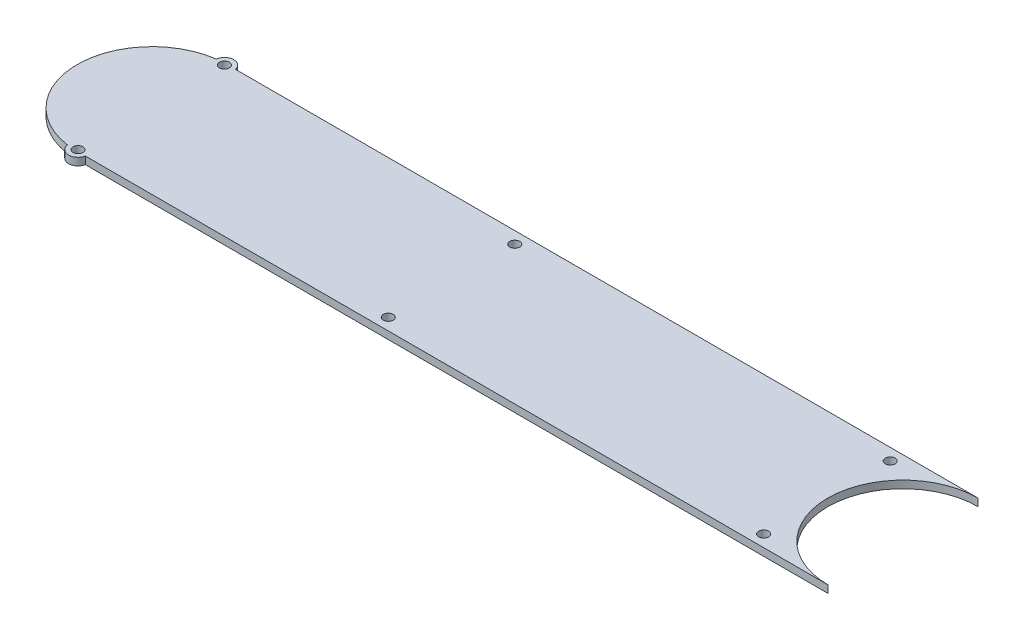
ISO-10303-21;
HEADER;
FILE_DESCRIPTION(('STEP AP214'),'2;1');
FILE_NAME('part.step','',(''),(''),'','','');
FILE_SCHEMA(('AUTOMOTIVE_DESIGN { 1 0 10303 214 1 1 1 1 }'));
ENDSEC;
DATA;
#1=APPLICATION_CONTEXT('core data for automotive mechanical design processes');
#2=APPLICATION_PROTOCOL_DEFINITION('international standard','automotive_design',2000,#1);
#3=PRODUCT_CONTEXT('',#1,'mechanical');
#4=PRODUCT('Part','Part','',(#3));
#5=PRODUCT_RELATED_PRODUCT_CATEGORY('part','',(#4));
#6=PRODUCT_DEFINITION_FORMATION('','',#4);
#7=PRODUCT_DEFINITION_CONTEXT('part definition',#1,'design');
#8=PRODUCT_DEFINITION('design','',#6,#7);
#9=PRODUCT_DEFINITION_SHAPE('','',#8);
#10=(LENGTH_UNIT() NAMED_UNIT(*) SI_UNIT(.MILLI.,.METRE.));
#11=(NAMED_UNIT(*) PLANE_ANGLE_UNIT() SI_UNIT($,.RADIAN.));
#12=(NAMED_UNIT(*) SI_UNIT($,.STERADIAN.) SOLID_ANGLE_UNIT());
#13=UNCERTAINTY_MEASURE_WITH_UNIT(LENGTH_MEASURE(1.E-05),#10,'distance_accuracy_value','');
#14=(GEOMETRIC_REPRESENTATION_CONTEXT(3) GLOBAL_UNCERTAINTY_ASSIGNED_CONTEXT((#13)) GLOBAL_UNIT_ASSIGNED_CONTEXT((#10,
#11,#12)) REPRESENTATION_CONTEXT('',''));
#15=CARTESIAN_POINT('',(0.,0.,0.));
#16=DIRECTION('',(0.,0.,1.));
#17=DIRECTION('',(1.,0.,0.));
#18=AXIS2_PLACEMENT_3D('',#15,#16,#17);
#19=CARTESIAN_POINT('',(-110.,2.,0.));
#20=DIRECTION('',(0.,-1.,0.));
#21=DIRECTION('',(0.,0.,-1.));
#22=AXIS2_PLACEMENT_3D('',#19,#20,#21);
#23=CYLINDRICAL_SURFACE('',#22,20.);
#24=CARTESIAN_POINT('',(-110.,2.,0.));
#25=DIRECTION('',(0.,1.,0.));
#26=DIRECTION('',(0.,0.,1.));
#27=AXIS2_PLACEMENT_3D('',#24,#25,#26);
#28=CIRCLE('',#27,20.);
#29=CARTESIAN_POINT('',(-112.730360118159,2.,-19.8127517933569));
#30=VERTEX_POINT('',#29);
#31=CARTESIAN_POINT('',(-112.730360118159,2.,19.8127517933569));
#32=VERTEX_POINT('',#31);
#33=EDGE_CURVE('E96',#30,#32,#28,.T.);
#34=ORIENTED_EDGE('',*,*,#33,.F.);
#35=DIRECTION('',(0.,1.,0.));
#36=VECTOR('',#35,1.);
#37=CARTESIAN_POINT('',(-112.730360118159,1.,-19.8127517933569));
#38=LINE('',#37,#36);
#39=CARTESIAN_POINT('',(-112.730360118159,0.,-19.8127517933569));
#40=VERTEX_POINT('',#39);
#41=EDGE_CURVE('E144',#30,#40,#38,.F.);
#42=ORIENTED_EDGE('',*,*,#41,.T.);
#43=CARTESIAN_POINT('',(-110.,0.,0.));
#44=DIRECTION('',(0.,1.,0.));
#45=DIRECTION('',(0.,0.,1.));
#46=AXIS2_PLACEMENT_3D('',#43,#44,#45);
#47=CIRCLE('',#46,20.);
#48=CARTESIAN_POINT('',(-112.730360118159,0.,19.8127517933569));
#49=VERTEX_POINT('',#48);
#50=EDGE_CURVE('E113',#40,#49,#47,.T.);
#51=ORIENTED_EDGE('',*,*,#50,.T.);
#52=DIRECTION('',(0.,1.,0.));
#53=VECTOR('',#52,1.);
#54=CARTESIAN_POINT('',(-112.730360118159,1.,19.8127517933569));
#55=LINE('',#54,#53);
#56=EDGE_CURVE('E137',#49,#32,#55,.T.);
#57=ORIENTED_EDGE('',*,*,#56,.T.);
#58=EDGE_LOOP('',(#34,#42,#51,#57));
#59=FACE_BOUND('',#58,.T.);
#60=ADVANCED_FACE('F37',(#59),#23,.T.);
#61=CARTESIAN_POINT('',(-110.,2.,20.));
#62=DIRECTION('',(0.,0.,-1.));
#63=DIRECTION('',(-1.,0.,0.));
#64=AXIS2_PLACEMENT_3D('',#61,#62,#63);
#65=PLANE('',#64);
#66=DIRECTION('',(1.,0.,0.));
#67=VECTOR('',#66,1.);
#68=CARTESIAN_POINT('',(-110.,2.,20.));
#69=LINE('',#68,#67);
#70=CARTESIAN_POINT('',(-107.800510257217,2.,20.));
#71=VERTEX_POINT('',#70);
#72=CARTESIAN_POINT('',(90.,2.,20.));
#73=VERTEX_POINT('',#72);
#74=EDGE_CURVE('E98',#71,#73,#69,.T.);
#75=ORIENTED_EDGE('',*,*,#74,.F.);
#76=DIRECTION('',(0.,1.,0.));
#77=VECTOR('',#76,1.);
#78=CARTESIAN_POINT('',(-107.800510257217,0.,20.));
#79=LINE('',#78,#77);
#80=CARTESIAN_POINT('',(-107.800510257217,0.,20.));
#81=VERTEX_POINT('',#80);
#82=EDGE_CURVE('E139',#71,#81,#79,.F.);
#83=ORIENTED_EDGE('',*,*,#82,.T.);
#84=DIRECTION('',(1.,0.,0.));
#85=VECTOR('',#84,1.);
#86=CARTESIAN_POINT('',(-110.,0.,20.));
#87=LINE('',#86,#85);
#88=CARTESIAN_POINT('',(90.,0.,20.));
#89=VERTEX_POINT('',#88);
#90=EDGE_CURVE('E81',#81,#89,#87,.T.);
#91=ORIENTED_EDGE('',*,*,#90,.T.);
#92=DIRECTION('',(0.,-1.,0.));
#93=VECTOR('',#92,1.);
#94=CARTESIAN_POINT('',(90.,2.,20.));
#95=LINE('',#94,#93);
#96=EDGE_CURVE('E11',#73,#89,#95,.T.);
#97=ORIENTED_EDGE('',*,*,#96,.F.);
#98=EDGE_LOOP('',(#75,#83,#91,#97));
#99=FACE_BOUND('',#98,.T.);
#100=ADVANCED_FACE('F206',(#99),#65,.F.);
#101=CARTESIAN_POINT('',(90.,2.,0.));
#102=DIRECTION('',(0.,-1.,0.));
#103=DIRECTION('',(0.,0.,-1.));
#104=AXIS2_PLACEMENT_3D('',#101,#102,#103);
#105=CYLINDRICAL_SURFACE('',#104,20.);
#106=CARTESIAN_POINT('',(90.,0.,0.));
#107=DIRECTION('',(0.,-1.,0.));
#108=DIRECTION('',(0.,0.,1.));
#109=AXIS2_PLACEMENT_3D('',#106,#107,#108);
#110=CIRCLE('',#109,20.);
#111=CARTESIAN_POINT('',(90.,0.,-20.));
#112=VERTEX_POINT('',#111);
#113=EDGE_CURVE('E72',#89,#112,#110,.T.);
#114=ORIENTED_EDGE('',*,*,#113,.T.);
#115=DIRECTION('',(0.,-1.,0.));
#116=VECTOR('',#115,1.);
#117=CARTESIAN_POINT('',(90.,2.,-20.));
#118=LINE('',#117,#116);
#119=CARTESIAN_POINT('',(90.,2.,-20.));
#120=VERTEX_POINT('',#119);
#121=EDGE_CURVE('E45',#120,#112,#118,.T.);
#122=ORIENTED_EDGE('',*,*,#121,.F.);
#123=CARTESIAN_POINT('',(90.,2.,0.));
#124=DIRECTION('',(0.,-1.,0.));
#125=DIRECTION('',(0.,0.,1.));
#126=AXIS2_PLACEMENT_3D('',#123,#124,#125);
#127=CIRCLE('',#126,20.);
#128=EDGE_CURVE('E60',#73,#120,#127,.T.);
#129=ORIENTED_EDGE('',*,*,#128,.F.);
#130=ORIENTED_EDGE('',*,*,#96,.T.);
#131=EDGE_LOOP('',(#114,#122,#129,#130));
#132=FACE_BOUND('',#131,.T.);
#133=ADVANCED_FACE('F74',(#132),#105,.F.);
#134=CARTESIAN_POINT('',(-110.,2.,-20.));
#135=DIRECTION('',(0.,0.,1.));
#136=DIRECTION('',(1.,0.,0.));
#137=AXIS2_PLACEMENT_3D('',#134,#135,#136);
#138=PLANE('',#137);
#139=DIRECTION('',(-1.,0.,0.));
#140=VECTOR('',#139,1.);
#141=CARTESIAN_POINT('',(-110.,0.,-20.));
#142=LINE('',#141,#140);
#143=CARTESIAN_POINT('',(-107.800510257217,0.,-20.));
#144=VERTEX_POINT('',#143);
#145=EDGE_CURVE('E80',#112,#144,#142,.T.);
#146=ORIENTED_EDGE('',*,*,#145,.T.);
#147=DIRECTION('',(0.,1.,0.));
#148=VECTOR('',#147,1.);
#149=CARTESIAN_POINT('',(-107.800510257217,0.,-20.));
#150=LINE('',#149,#148);
#151=CARTESIAN_POINT('',(-107.800510257217,2.,-20.));
#152=VERTEX_POINT('',#151);
#153=EDGE_CURVE('E148',#144,#152,#150,.T.);
#154=ORIENTED_EDGE('',*,*,#153,.T.);
#155=DIRECTION('',(-1.,0.,0.));
#156=VECTOR('',#155,1.);
#157=CARTESIAN_POINT('',(-110.,2.,-20.));
#158=LINE('',#157,#156);
#159=EDGE_CURVE('E88',#120,#152,#158,.T.);
#160=ORIENTED_EDGE('',*,*,#159,.F.);
#161=ORIENTED_EDGE('',*,*,#121,.T.);
#162=EDGE_LOOP('',(#146,#154,#160,#161));
#163=FACE_BOUND('',#162,.T.);
#164=ADVANCED_FACE('F85',(#163),#138,.F.);
#165=CARTESIAN_POINT('',(-110.,2.,0.));
#166=DIRECTION('',(0.,1.,0.));
#167=DIRECTION('',(0.,0.,1.));
#168=AXIS2_PLACEMENT_3D('',#165,#166,#167);
#169=PLANE('',#168);
#170=CARTESIAN_POINT('',(-110.25,2.,-19.5));
#171=DIRECTION('',(0.,1.,0.));
#172=DIRECTION('',(0.,0.,1.));
#173=AXIS2_PLACEMENT_3D('',#170,#171,#172);
#174=CIRCLE('',#173,1.32500000000001);
#175=CARTESIAN_POINT('',(-110.25,2.,-18.175));
#176=VERTEX_POINT('',#175);
#177=EDGE_CURVE('E161',#176,#176,#174,.T.);
#178=ORIENTED_EDGE('',*,*,#177,.F.);
#179=EDGE_LOOP('',(#178));
#180=FACE_BOUND('',#179,.T.);
#181=CARTESIAN_POINT('',(-110.25,2.,19.5));
#182=DIRECTION('',(0.,1.,0.));
#183=DIRECTION('',(0.,0.,1.));
#184=AXIS2_PLACEMENT_3D('',#181,#182,#183);
#185=CIRCLE('',#184,1.32500000000001);
#186=CARTESIAN_POINT('',(-110.25,2.,20.825));
#187=VERTEX_POINT('',#186);
#188=EDGE_CURVE('E155',#187,#187,#185,.T.);
#189=ORIENTED_EDGE('',*,*,#188,.F.);
#190=EDGE_LOOP('',(#189));
#191=FACE_BOUND('',#190,.T.);
#192=CARTESIAN_POINT('',(-110.25,2.,-19.5));
#193=DIRECTION('',(0.,1.,0.));
#194=DIRECTION('',(0.,0.,1.));
#195=AXIS2_PLACEMENT_3D('',#192,#193,#194);
#196=CIRCLE('',#195,2.5);
#197=EDGE_CURVE('E150',#152,#30,#196,.T.);
#198=ORIENTED_EDGE('',*,*,#197,.T.);
#199=ORIENTED_EDGE('',*,*,#33,.T.);
#200=CARTESIAN_POINT('',(-110.25,2.,19.5));
#201=DIRECTION('',(0.,1.,0.));
#202=DIRECTION('',(0.,0.,1.));
#203=AXIS2_PLACEMENT_3D('',#200,#201,#202);
#204=CIRCLE('',#203,2.50000000000001);
#205=EDGE_CURVE('E53',#32,#71,#204,.T.);
#206=ORIENTED_EDGE('',*,*,#205,.T.);
#207=ORIENTED_EDGE('',*,*,#74,.T.);
#208=ORIENTED_EDGE('',*,*,#128,.T.);
#209=ORIENTED_EDGE('',*,*,#159,.T.);
#210=EDGE_LOOP('',(#198,#199,#206,#207,#208,#209));
#211=FACE_BOUND('',#210,.T.);
#212=CARTESIAN_POINT('',(69.75,2.,-16.85));
#213=DIRECTION('',(0.,1.,0.));
#214=DIRECTION('',(0.,0.,1.));
#215=AXIS2_PLACEMENT_3D('',#212,#213,#214);
#216=CIRCLE('',#215,1.32500000000001);
#217=CARTESIAN_POINT('',(69.75,2.,-15.525));
#218=VERTEX_POINT('',#217);
#219=EDGE_CURVE('E128',#218,#218,#216,.T.);
#220=ORIENTED_EDGE('',*,*,#219,.F.);
#221=EDGE_LOOP('',(#220));
#222=FACE_BOUND('',#221,.T.);
#223=CARTESIAN_POINT('',(-30.25,2.,16.85));
#224=DIRECTION('',(0.,1.,0.));
#225=DIRECTION('',(0.,0.,1.));
#226=AXIS2_PLACEMENT_3D('',#223,#224,#225);
#227=CIRCLE('',#226,1.32500000000001);
#228=CARTESIAN_POINT('',(-30.25,2.,18.175));
#229=VERTEX_POINT('',#228);
#230=EDGE_CURVE('E129',#229,#229,#227,.T.);
#231=ORIENTED_EDGE('',*,*,#230,.F.);
#232=EDGE_LOOP('',(#231));
#233=FACE_BOUND('',#232,.T.);
#234=CARTESIAN_POINT('',(-30.25,2.,-16.85));
#235=DIRECTION('',(0.,1.,0.));
#236=DIRECTION('',(0.,0.,1.));
#237=AXIS2_PLACEMENT_3D('',#234,#235,#236);
#238=CIRCLE('',#237,1.32500000000001);
#239=CARTESIAN_POINT('',(-30.25,2.,-15.525));
#240=VERTEX_POINT('',#239);
#241=EDGE_CURVE('E132',#240,#240,#238,.T.);
#242=ORIENTED_EDGE('',*,*,#241,.F.);
#243=EDGE_LOOP('',(#242));
#244=FACE_BOUND('',#243,.T.);
#245=CARTESIAN_POINT('',(69.75,2.,16.85));
#246=DIRECTION('',(0.,1.,0.));
#247=DIRECTION('',(0.,0.,1.));
#248=AXIS2_PLACEMENT_3D('',#245,#246,#247);
#249=CIRCLE('',#248,1.32500000000001);
#250=CARTESIAN_POINT('',(69.75,2.,18.175));
#251=VERTEX_POINT('',#250);
#252=EDGE_CURVE('E106',#251,#251,#249,.T.);
#253=ORIENTED_EDGE('',*,*,#252,.F.);
#254=EDGE_LOOP('',(#253));
#255=FACE_BOUND('',#254,.T.);
#256=ADVANCED_FACE('F176',(#180,#191,#211,#222,#233,#244,#255),#169,.T.);
#257=CARTESIAN_POINT('',(-110.,0.,0.));
#258=DIRECTION('',(0.,1.,0.));
#259=DIRECTION('',(0.,0.,1.));
#260=AXIS2_PLACEMENT_3D('',#257,#258,#259);
#261=PLANE('',#260);
#262=CARTESIAN_POINT('',(-110.25,0.,-19.5));
#263=DIRECTION('',(0.,1.,0.));
#264=DIRECTION('',(0.,0.,1.));
#265=AXIS2_PLACEMENT_3D('',#262,#263,#264);
#266=CIRCLE('',#265,1.32500000000001);
#267=CARTESIAN_POINT('',(-110.25,0.,-18.175));
#268=VERTEX_POINT('',#267);
#269=EDGE_CURVE('E153',#268,#268,#266,.T.);
#270=ORIENTED_EDGE('',*,*,#269,.T.);
#271=EDGE_LOOP('',(#270));
#272=FACE_BOUND('',#271,.T.);
#273=CARTESIAN_POINT('',(-110.25,0.,19.5));
#274=DIRECTION('',(0.,1.,0.));
#275=DIRECTION('',(0.,0.,1.));
#276=AXIS2_PLACEMENT_3D('',#273,#274,#275);
#277=CIRCLE('',#276,1.32500000000001);
#278=CARTESIAN_POINT('',(-110.25,0.,20.825));
#279=VERTEX_POINT('',#278);
#280=EDGE_CURVE('E158',#279,#279,#277,.T.);
#281=ORIENTED_EDGE('',*,*,#280,.T.);
#282=EDGE_LOOP('',(#281));
#283=FACE_BOUND('',#282,.T.);
#284=ORIENTED_EDGE('',*,*,#50,.F.);
#285=CARTESIAN_POINT('',(-110.25,0.,-19.5));
#286=DIRECTION('',(0.,1.,0.));
#287=DIRECTION('',(0.,0.,1.));
#288=AXIS2_PLACEMENT_3D('',#285,#286,#287);
#289=CIRCLE('',#288,2.5);
#290=EDGE_CURVE('E95',#144,#40,#289,.T.);
#291=ORIENTED_EDGE('',*,*,#290,.F.);
#292=ORIENTED_EDGE('',*,*,#145,.F.);
#293=ORIENTED_EDGE('',*,*,#113,.F.);
#294=ORIENTED_EDGE('',*,*,#90,.F.);
#295=CARTESIAN_POINT('',(-110.25,0.,19.5));
#296=DIRECTION('',(0.,1.,0.));
#297=DIRECTION('',(0.,0.,1.));
#298=AXIS2_PLACEMENT_3D('',#295,#296,#297);
#299=CIRCLE('',#298,2.50000000000001);
#300=EDGE_CURVE('E142',#49,#81,#299,.T.);
#301=ORIENTED_EDGE('',*,*,#300,.F.);
#302=EDGE_LOOP('',(#284,#291,#292,#293,#294,#301));
#303=FACE_BOUND('',#302,.T.);
#304=CARTESIAN_POINT('',(69.75,0.,-16.85));
#305=DIRECTION('',(0.,1.,0.));
#306=DIRECTION('',(0.,0.,1.));
#307=AXIS2_PLACEMENT_3D('',#304,#305,#306);
#308=CIRCLE('',#307,1.32500000000001);
#309=CARTESIAN_POINT('',(69.75,0.,-15.525));
#310=VERTEX_POINT('',#309);
#311=EDGE_CURVE('E40',#310,#310,#308,.T.);
#312=ORIENTED_EDGE('',*,*,#311,.T.);
#313=EDGE_LOOP('',(#312));
#314=FACE_BOUND('',#313,.T.);
#315=CARTESIAN_POINT('',(-30.25,0.,16.85));
#316=DIRECTION('',(0.,1.,0.));
#317=DIRECTION('',(0.,0.,1.));
#318=AXIS2_PLACEMENT_3D('',#315,#316,#317);
#319=CIRCLE('',#318,1.32500000000001);
#320=CARTESIAN_POINT('',(-30.25,0.,18.175));
#321=VERTEX_POINT('',#320);
#322=EDGE_CURVE('E108',#321,#321,#319,.T.);
#323=ORIENTED_EDGE('',*,*,#322,.T.);
#324=EDGE_LOOP('',(#323));
#325=FACE_BOUND('',#324,.T.);
#326=CARTESIAN_POINT('',(-30.25,0.,-16.85));
#327=DIRECTION('',(0.,1.,0.));
#328=DIRECTION('',(0.,0.,1.));
#329=AXIS2_PLACEMENT_3D('',#326,#327,#328);
#330=CIRCLE('',#329,1.32500000000001);
#331=CARTESIAN_POINT('',(-30.25,0.,-15.525));
#332=VERTEX_POINT('',#331);
#333=EDGE_CURVE('E105',#332,#332,#330,.T.);
#334=ORIENTED_EDGE('',*,*,#333,.T.);
#335=EDGE_LOOP('',(#334));
#336=FACE_BOUND('',#335,.T.);
#337=CARTESIAN_POINT('',(69.75,0.,16.85));
#338=DIRECTION('',(0.,1.,0.));
#339=DIRECTION('',(0.,0.,1.));
#340=AXIS2_PLACEMENT_3D('',#337,#338,#339);
#341=CIRCLE('',#340,1.32500000000001);
#342=CARTESIAN_POINT('',(69.75,0.,18.175));
#343=VERTEX_POINT('',#342);
#344=EDGE_CURVE('E102',#343,#343,#341,.T.);
#345=ORIENTED_EDGE('',*,*,#344,.T.);
#346=EDGE_LOOP('',(#345));
#347=FACE_BOUND('',#346,.T.);
#348=ADVANCED_FACE('F92',(#272,#283,#303,#314,#325,#336,#347),#261,.F.);
#349=CARTESIAN_POINT('',(69.75,-1.,16.85));
#350=DIRECTION('',(0.,1.,0.));
#351=DIRECTION('',(0.,0.,1.));
#352=AXIS2_PLACEMENT_3D('',#349,#350,#351);
#353=CYLINDRICAL_SURFACE('',#352,1.32500000000001);
#354=ORIENTED_EDGE('',*,*,#252,.T.);
#355=EDGE_LOOP('',(#354));
#356=FACE_BOUND('',#355,.T.);
#357=ORIENTED_EDGE('',*,*,#344,.F.);
#358=EDGE_LOOP('',(#357));
#359=FACE_BOUND('',#358,.T.);
#360=ADVANCED_FACE('F193',(#356,#359),#353,.F.);
#361=CARTESIAN_POINT('',(-30.25,-1.,-16.85));
#362=DIRECTION('',(0.,1.,0.));
#363=DIRECTION('',(0.,0.,1.));
#364=AXIS2_PLACEMENT_3D('',#361,#362,#363);
#365=CYLINDRICAL_SURFACE('',#364,1.32500000000001);
#366=ORIENTED_EDGE('',*,*,#241,.T.);
#367=EDGE_LOOP('',(#366));
#368=FACE_BOUND('',#367,.T.);
#369=ORIENTED_EDGE('',*,*,#333,.F.);
#370=EDGE_LOOP('',(#369));
#371=FACE_BOUND('',#370,.T.);
#372=ADVANCED_FACE('F196',(#368,#371),#365,.F.);
#373=CARTESIAN_POINT('',(-30.25,-1.,16.85));
#374=DIRECTION('',(0.,1.,0.));
#375=DIRECTION('',(0.,0.,1.));
#376=AXIS2_PLACEMENT_3D('',#373,#374,#375);
#377=CYLINDRICAL_SURFACE('',#376,1.32500000000001);
#378=ORIENTED_EDGE('',*,*,#230,.T.);
#379=EDGE_LOOP('',(#378));
#380=FACE_BOUND('',#379,.T.);
#381=ORIENTED_EDGE('',*,*,#322,.F.);
#382=EDGE_LOOP('',(#381));
#383=FACE_BOUND('',#382,.T.);
#384=ADVANCED_FACE('F241',(#380,#383),#377,.F.);
#385=CARTESIAN_POINT('',(69.75,-1.,-16.85));
#386=DIRECTION('',(0.,1.,0.));
#387=DIRECTION('',(0.,0.,1.));
#388=AXIS2_PLACEMENT_3D('',#385,#386,#387);
#389=CYLINDRICAL_SURFACE('',#388,1.32500000000001);
#390=ORIENTED_EDGE('',*,*,#219,.T.);
#391=EDGE_LOOP('',(#390));
#392=FACE_BOUND('',#391,.T.);
#393=ORIENTED_EDGE('',*,*,#311,.F.);
#394=EDGE_LOOP('',(#393));
#395=FACE_BOUND('',#394,.T.);
#396=ADVANCED_FACE('F236',(#392,#395),#389,.F.);
#397=CARTESIAN_POINT('',(-110.25,0.,19.5));
#398=DIRECTION('',(0.,1.,0.));
#399=DIRECTION('',(0.,0.,1.));
#400=AXIS2_PLACEMENT_3D('',#397,#398,#399);
#401=CYLINDRICAL_SURFACE('',#400,2.50000000000001);
#402=ORIENTED_EDGE('',*,*,#56,.F.);
#403=ORIENTED_EDGE('',*,*,#300,.T.);
#404=ORIENTED_EDGE('',*,*,#82,.F.);
#405=ORIENTED_EDGE('',*,*,#205,.F.);
#406=EDGE_LOOP('',(#402,#403,#404,#405));
#407=FACE_BOUND('',#406,.T.);
#408=ADVANCED_FACE('F217',(#407),#401,.T.);
#409=CARTESIAN_POINT('',(-110.25,0.,-19.5));
#410=DIRECTION('',(0.,1.,0.));
#411=DIRECTION('',(0.,0.,1.));
#412=AXIS2_PLACEMENT_3D('',#409,#410,#411);
#413=CYLINDRICAL_SURFACE('',#412,2.5);
#414=ORIENTED_EDGE('',*,*,#41,.F.);
#415=ORIENTED_EDGE('',*,*,#197,.F.);
#416=ORIENTED_EDGE('',*,*,#153,.F.);
#417=ORIENTED_EDGE('',*,*,#290,.T.);
#418=EDGE_LOOP('',(#414,#415,#416,#417));
#419=FACE_BOUND('',#418,.T.);
#420=ADVANCED_FACE('F227',(#419),#413,.T.);
#421=CARTESIAN_POINT('',(-110.25,0.,19.5));
#422=DIRECTION('',(0.,1.,0.));
#423=DIRECTION('',(0.,0.,1.));
#424=AXIS2_PLACEMENT_3D('',#421,#422,#423);
#425=CYLINDRICAL_SURFACE('',#424,1.32500000000001);
#426=ORIENTED_EDGE('',*,*,#280,.F.);
#427=EDGE_LOOP('',(#426));
#428=FACE_BOUND('',#427,.T.);
#429=ORIENTED_EDGE('',*,*,#188,.T.);
#430=EDGE_LOOP('',(#429));
#431=FACE_BOUND('',#430,.T.);
#432=ADVANCED_FACE('F172',(#428,#431),#425,.F.);
#433=CARTESIAN_POINT('',(-110.25,0.,-19.5));
#434=DIRECTION('',(0.,1.,0.));
#435=DIRECTION('',(0.,0.,1.));
#436=AXIS2_PLACEMENT_3D('',#433,#434,#435);
#437=CYLINDRICAL_SURFACE('',#436,1.32500000000001);
#438=ORIENTED_EDGE('',*,*,#269,.F.);
#439=EDGE_LOOP('',(#438));
#440=FACE_BOUND('',#439,.T.);
#441=ORIENTED_EDGE('',*,*,#177,.T.);
#442=EDGE_LOOP('',(#441));
#443=FACE_BOUND('',#442,.T.);
#444=ADVANCED_FACE('F169',(#440,#443),#437,.F.);
#445=CLOSED_SHELL('',(#60,#100,#133,#164,#256,#348,#360,#372,#384,#396,#408,#420,#432,#444));
#446=MANIFOLD_SOLID_BREP('B2',#445);
#447=ADVANCED_BREP_SHAPE_REPRESENTATION('',(#18,#446),#14);
#448=SHAPE_DEFINITION_REPRESENTATION(#9,#447);
ENDSEC;
END-ISO-10303-21;
